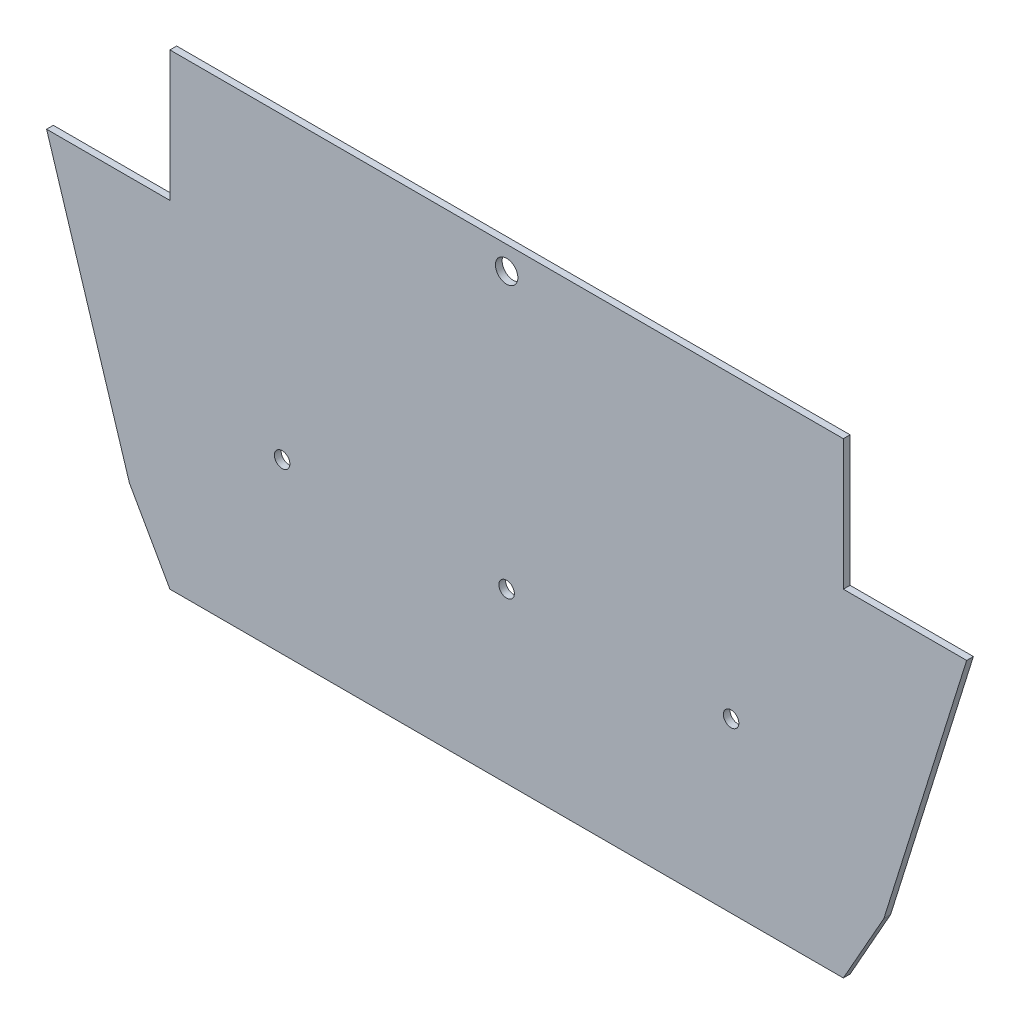
ISO-10303-21;
HEADER;
FILE_DESCRIPTION(('STEP AP214'),'2;1');
FILE_NAME('part.step','',(''),(''),'','','');
FILE_SCHEMA(('AUTOMOTIVE_DESIGN { 1 0 10303 214 1 1 1 1 }'));
ENDSEC;
DATA;
#1=APPLICATION_CONTEXT('core data for automotive mechanical design processes');
#2=APPLICATION_PROTOCOL_DEFINITION('international standard','automotive_design',2000,#1);
#3=PRODUCT_CONTEXT('',#1,'mechanical');
#4=PRODUCT('Part','Part','',(#3));
#5=PRODUCT_RELATED_PRODUCT_CATEGORY('part','',(#4));
#6=PRODUCT_DEFINITION_FORMATION('','',#4);
#7=PRODUCT_DEFINITION_CONTEXT('part definition',#1,'design');
#8=PRODUCT_DEFINITION('design','',#6,#7);
#9=PRODUCT_DEFINITION_SHAPE('','',#8);
#10=(LENGTH_UNIT() NAMED_UNIT(*) SI_UNIT(.MILLI.,.METRE.));
#11=(NAMED_UNIT(*) PLANE_ANGLE_UNIT() SI_UNIT($,.RADIAN.));
#12=(NAMED_UNIT(*) SI_UNIT($,.STERADIAN.) SOLID_ANGLE_UNIT());
#13=UNCERTAINTY_MEASURE_WITH_UNIT(LENGTH_MEASURE(1.E-05),#10,'distance_accuracy_value','');
#14=(GEOMETRIC_REPRESENTATION_CONTEXT(3) GLOBAL_UNCERTAINTY_ASSIGNED_CONTEXT((#13)) GLOBAL_UNIT_ASSIGNED_CONTEXT((#10,
#11,#12)) REPRESENTATION_CONTEXT('',''));
#15=CARTESIAN_POINT('',(0.,0.,0.));
#16=DIRECTION('',(0.,0.,1.));
#17=DIRECTION('',(1.,0.,0.));
#18=AXIS2_PLACEMENT_3D('',#15,#16,#17);
#19=CARTESIAN_POINT('',(0.,0.,-3.));
#20=DIRECTION('',(0.,-1.,0.));
#21=DIRECTION('',(0.,0.,-1.));
#22=AXIS2_PLACEMENT_3D('',#19,#20,#21);
#23=PLANE('',#22);
#24=DIRECTION('',(1.,0.,0.));
#25=VECTOR('',#24,1.);
#26=CARTESIAN_POINT('',(0.,0.,0.));
#27=LINE('',#26,#25);
#28=CARTESIAN_POINT('',(0.,0.,0.));
#29=VERTEX_POINT('',#28);
#30=CARTESIAN_POINT('',(300.,-3.40699690681845E-12,0.));
#31=VERTEX_POINT('',#30);
#32=EDGE_CURVE('E309',#29,#31,#27,.T.);
#33=ORIENTED_EDGE('',*,*,#32,.F.);
#34=DIRECTION('',(0.,0.,1.));
#35=VECTOR('',#34,1.);
#36=CARTESIAN_POINT('',(0.,0.,-3.));
#37=LINE('',#36,#35);
#38=CARTESIAN_POINT('',(0.,0.,-3.));
#39=VERTEX_POINT('',#38);
#40=EDGE_CURVE('E315',#39,#29,#37,.T.);
#41=ORIENTED_EDGE('',*,*,#40,.F.);
#42=DIRECTION('',(1.,0.,0.));
#43=VECTOR('',#42,1.);
#44=CARTESIAN_POINT('',(0.,0.,-3.));
#45=LINE('',#44,#43);
#46=CARTESIAN_POINT('',(300.,-3.40005801291454E-12,-3.));
#47=VERTEX_POINT('',#46);
#48=EDGE_CURVE('E312',#39,#47,#45,.T.);
#49=ORIENTED_EDGE('',*,*,#48,.T.);
#50=DIRECTION('',(0.,0.,1.));
#51=VECTOR('',#50,1.);
#52=CARTESIAN_POINT('',(300.,0.,-3.));
#53=LINE('',#52,#51);
#54=EDGE_CURVE('E318',#47,#31,#53,.T.);
#55=ORIENTED_EDGE('',*,*,#54,.T.);
#56=EDGE_LOOP('',(#33,#41,#49,#55));
#57=FACE_BOUND('',#56,.T.);
#58=ADVANCED_FACE('F142',(#57),#23,.T.);
#59=CARTESIAN_POINT('',(0.,0.,-3.));
#60=DIRECTION('',(0.,0.,-1.));
#61=DIRECTION('',(-1.,0.,0.));
#62=AXIS2_PLACEMENT_3D('',#59,#60,#61);
#63=PLANE('',#62);
#64=CARTESIAN_POINT('',(250.,75.,-3.));
#65=DIRECTION('',(0.,0.,1.));
#66=DIRECTION('',(1.,0.,0.));
#67=AXIS2_PLACEMENT_3D('',#64,#65,#66);
#68=CIRCLE('',#67,3.45);
#69=CARTESIAN_POINT('',(253.45,75.,-3.));
#70=VERTEX_POINT('',#69);
#71=EDGE_CURVE('E294',#70,#70,#68,.T.);
#72=ORIENTED_EDGE('',*,*,#71,.T.);
#73=EDGE_LOOP('',(#72));
#74=FACE_BOUND('',#73,.T.);
#75=CARTESIAN_POINT('',(150.,75.,-3.));
#76=DIRECTION('',(0.,0.,1.));
#77=DIRECTION('',(1.,0.,0.));
#78=AXIS2_PLACEMENT_3D('',#75,#76,#77);
#79=CIRCLE('',#78,3.45);
#80=CARTESIAN_POINT('',(153.45,75.,-3.));
#81=VERTEX_POINT('',#80);
#82=EDGE_CURVE('E300',#81,#81,#79,.T.);
#83=ORIENTED_EDGE('',*,*,#82,.T.);
#84=EDGE_LOOP('',(#83));
#85=FACE_BOUND('',#84,.T.);
#86=CARTESIAN_POINT('',(50.,75.,-3.));
#87=DIRECTION('',(0.,0.,1.));
#88=DIRECTION('',(1.,0.,0.));
#89=AXIS2_PLACEMENT_3D('',#86,#87,#88);
#90=CIRCLE('',#89,3.45);
#91=CARTESIAN_POINT('',(53.45,75.,-3.));
#92=VERTEX_POINT('',#91);
#93=EDGE_CURVE('E306',#92,#92,#90,.T.);
#94=ORIENTED_EDGE('',*,*,#93,.T.);
#95=EDGE_LOOP('',(#94));
#96=FACE_BOUND('',#95,.T.);
#97=ORIENTED_EDGE('',*,*,#48,.F.);
#98=DIRECTION('',(-0.491586972368609,0.870828484029699,0.));
#99=VECTOR('',#98,1.);
#100=CARTESIAN_POINT('',(0.,0.,-3.));
#101=LINE('',#100,#99);
#102=CARTESIAN_POINT('',(-18.0641577581412,32.,-3.));
#103=VERTEX_POINT('',#102);
#104=EDGE_CURVE('E283',#39,#103,#101,.T.);
#105=ORIENTED_EDGE('',*,*,#104,.T.);
#106=DIRECTION('',(0.298274993135947,-0.95447997803503,0.));
#107=VECTOR('',#106,1.);
#108=CARTESIAN_POINT('',(-7.79725384355057,-0.854092526690381,-3.00000000000007));
#109=LINE('',#108,#107);
#110=CARTESIAN_POINT('',(-54.9391577581413,150.,-2.99999999999974));
#111=VERTEX_POINT('',#110);
#112=EDGE_CURVE('E270',#111,#103,#109,.T.);
#113=ORIENTED_EDGE('',*,*,#112,.F.);
#114=DIRECTION('',(-1.,0.,0.));
#115=VECTOR('',#114,1.);
#116=CARTESIAN_POINT('',(-9.03207887907068,150.,-3.));
#117=LINE('',#116,#115);
#118=CARTESIAN_POINT('',(0.,150.,-3.));
#119=VERTEX_POINT('',#118);
#120=EDGE_CURVE('E286',#111,#119,#117,.F.);
#121=ORIENTED_EDGE('',*,*,#120,.T.);
#122=DIRECTION('',(0.,1.,0.));
#123=VECTOR('',#122,1.);
#124=CARTESIAN_POINT('',(0.,159.032078879071,-3.));
#125=LINE('',#124,#123);
#126=CARTESIAN_POINT('',(0.,208.064157758141,-2.99999999999973));
#127=VERTEX_POINT('',#126);
#128=EDGE_CURVE('E226',#119,#127,#125,.T.);
#129=ORIENTED_EDGE('',*,*,#128,.T.);
#130=DIRECTION('',(1.,0.,0.));
#131=VECTOR('',#130,1.);
#132=CARTESIAN_POINT('',(0.,208.064157758141,-2.99999999999973));
#133=LINE('',#132,#131);
#134=CARTESIAN_POINT('',(300.,208.064157758141,-2.99999999999973));
#135=VERTEX_POINT('',#134);
#136=EDGE_CURVE('E229',#135,#127,#133,.F.);
#137=ORIENTED_EDGE('',*,*,#136,.F.);
#138=DIRECTION('',(0.,1.,0.));
#139=VECTOR('',#138,1.);
#140=CARTESIAN_POINT('',(300.,159.032078879071,-3.));
#141=LINE('',#140,#139);
#142=CARTESIAN_POINT('',(300.,150.,-3.));
#143=VERTEX_POINT('',#142);
#144=EDGE_CURVE('E218',#135,#143,#141,.F.);
#145=ORIENTED_EDGE('',*,*,#144,.T.);
#146=DIRECTION('',(-1.,0.,0.));
#147=VECTOR('',#146,1.);
#148=CARTESIAN_POINT('',(309.032078879071,150.,-3.));
#149=LINE('',#148,#147);
#150=CARTESIAN_POINT('',(354.939157758142,150.,-2.99999999999978));
#151=VERTEX_POINT('',#150);
#152=EDGE_CURVE('E265',#143,#151,#149,.F.);
#153=ORIENTED_EDGE('',*,*,#152,.T.);
#154=DIRECTION('',(0.298274993135947,0.95447997803503,0.));
#155=VECTOR('',#154,1.);
#156=CARTESIAN_POINT('',(308.064157758142,0.,-2.99999999999978));
#157=LINE('',#156,#155);
#158=CARTESIAN_POINT('',(318.064157758141,31.9999999999964,-3.));
#159=VERTEX_POINT('',#158);
#160=EDGE_CURVE('E253',#159,#151,#157,.T.);
#161=ORIENTED_EDGE('',*,*,#160,.F.);
#162=DIRECTION('',(-0.491586972368612,-0.870828484029698,0.));
#163=VECTOR('',#162,1.);
#164=CARTESIAN_POINT('',(318.064157758141,31.9999999999964,-3.));
#165=LINE('',#164,#163);
#166=EDGE_CURVE('E267',#159,#47,#165,.T.);
#167=ORIENTED_EDGE('',*,*,#166,.T.);
#168=EDGE_LOOP('',(#97,#105,#113,#121,#129,#137,#145,#153,#161,#167));
#169=FACE_BOUND('',#168,.T.);
#170=CARTESIAN_POINT('',(150.,197.653482949051,-2.99999999999981));
#171=DIRECTION('',(0.,0.,-1.));
#172=DIRECTION('',(0.,1.,0.));
#173=AXIS2_PLACEMENT_3D('',#170,#171,#172);
#174=CIRCLE('',#173,5.00000000000002);
#175=CARTESIAN_POINT('',(150.,202.653482949051,-2.99999999999977));
#176=VERTEX_POINT('',#175);
#177=EDGE_CURVE('E242',#176,#176,#174,.T.);
#178=ORIENTED_EDGE('',*,*,#177,.F.);
#179=EDGE_LOOP('',(#178));
#180=FACE_BOUND('',#179,.T.);
#181=ADVANCED_FACE('F231',(#74,#85,#96,#169,#180),#63,.T.);
#182=CARTESIAN_POINT('',(0.,0.,0.));
#183=DIRECTION('',(0.,0.,-1.));
#184=DIRECTION('',(-1.,0.,0.));
#185=AXIS2_PLACEMENT_3D('',#182,#183,#184);
#186=PLANE('',#185);
#187=CARTESIAN_POINT('',(250.,75.,0.));
#188=DIRECTION('',(0.,0.,1.));
#189=DIRECTION('',(1.,0.,0.));
#190=AXIS2_PLACEMENT_3D('',#187,#188,#189);
#191=CIRCLE('',#190,3.45);
#192=CARTESIAN_POINT('',(253.45,75.,0.));
#193=VERTEX_POINT('',#192);
#194=EDGE_CURVE('E289',#193,#193,#191,.T.);
#195=ORIENTED_EDGE('',*,*,#194,.F.);
#196=EDGE_LOOP('',(#195));
#197=FACE_BOUND('',#196,.T.);
#198=CARTESIAN_POINT('',(150.,75.,0.));
#199=DIRECTION('',(0.,0.,1.));
#200=DIRECTION('',(1.,0.,0.));
#201=AXIS2_PLACEMENT_3D('',#198,#199,#200);
#202=CIRCLE('',#201,3.45);
#203=CARTESIAN_POINT('',(153.45,75.,0.));
#204=VERTEX_POINT('',#203);
#205=EDGE_CURVE('E297',#204,#204,#202,.T.);
#206=ORIENTED_EDGE('',*,*,#205,.F.);
#207=EDGE_LOOP('',(#206));
#208=FACE_BOUND('',#207,.T.);
#209=CARTESIAN_POINT('',(50.,75.,0.));
#210=DIRECTION('',(0.,0.,1.));
#211=DIRECTION('',(1.,0.,0.));
#212=AXIS2_PLACEMENT_3D('',#209,#210,#211);
#213=CIRCLE('',#212,3.45);
#214=CARTESIAN_POINT('',(53.45,75.,0.));
#215=VERTEX_POINT('',#214);
#216=EDGE_CURVE('E303',#215,#215,#213,.T.);
#217=ORIENTED_EDGE('',*,*,#216,.F.);
#218=EDGE_LOOP('',(#217));
#219=FACE_BOUND('',#218,.T.);
#220=DIRECTION('',(0.,1.,0.));
#221=VECTOR('',#220,1.);
#222=CARTESIAN_POINT('',(0.,159.032078879071,0.));
#223=LINE('',#222,#221);
#224=CARTESIAN_POINT('',(0.,150.,0.));
#225=VERTEX_POINT('',#224);
#226=CARTESIAN_POINT('',(0.,208.064157758141,2.77555756156289E-13));
#227=VERTEX_POINT('',#226);
#228=EDGE_CURVE('E250',#225,#227,#223,.T.);
#229=ORIENTED_EDGE('',*,*,#228,.F.);
#230=DIRECTION('',(-1.,0.,0.));
#231=VECTOR('',#230,1.);
#232=CARTESIAN_POINT('',(-9.03207887907068,150.,0.));
#233=LINE('',#232,#231);
#234=CARTESIAN_POINT('',(-54.9391577581413,150.,2.55004350968591E-13));
#235=VERTEX_POINT('',#234);
#236=EDGE_CURVE('E287',#235,#225,#233,.F.);
#237=ORIENTED_EDGE('',*,*,#236,.F.);
#238=DIRECTION('',(0.298274993135947,-0.95447997803503,0.));
#239=VECTOR('',#238,1.);
#240=CARTESIAN_POINT('',(-7.79725384355055,-0.854092526690381,0.));
#241=LINE('',#240,#239);
#242=CARTESIAN_POINT('',(-18.0641577581413,32.,0.));
#243=VERTEX_POINT('',#242);
#244=EDGE_CURVE('E277',#235,#243,#241,.T.);
#245=ORIENTED_EDGE('',*,*,#244,.T.);
#246=DIRECTION('',(-0.491586972368609,0.870828484029699,0.));
#247=VECTOR('',#246,1.);
#248=CARTESIAN_POINT('',(0.,0.,0.));
#249=LINE('',#248,#247);
#250=EDGE_CURVE('E276',#29,#243,#249,.T.);
#251=ORIENTED_EDGE('',*,*,#250,.F.);
#252=ORIENTED_EDGE('',*,*,#32,.T.);
#253=DIRECTION('',(-0.491586972368612,-0.870828484029698,0.));
#254=VECTOR('',#253,1.);
#255=CARTESIAN_POINT('',(318.064157758141,31.9999999999964,0.));
#256=LINE('',#255,#254);
#257=CARTESIAN_POINT('',(318.064157758141,31.9999999999964,2.22044604925031E-13));
#258=VERTEX_POINT('',#257);
#259=EDGE_CURVE('E165',#258,#31,#256,.T.);
#260=ORIENTED_EDGE('',*,*,#259,.F.);
#261=DIRECTION('',(0.298274993135947,0.95447997803503,0.));
#262=VECTOR('',#261,1.);
#263=CARTESIAN_POINT('',(308.064157758142,0.,2.22044604925031E-13));
#264=LINE('',#263,#262);
#265=CARTESIAN_POINT('',(354.939157758142,150.,2.22044604925031E-13));
#266=VERTEX_POINT('',#265);
#267=EDGE_CURVE('E260',#258,#266,#264,.T.);
#268=ORIENTED_EDGE('',*,*,#267,.T.);
#269=DIRECTION('',(-1.,0.,0.));
#270=VECTOR('',#269,1.);
#271=CARTESIAN_POINT('',(309.032078879071,150.,0.));
#272=LINE('',#271,#270);
#273=CARTESIAN_POINT('',(300.,150.,0.));
#274=VERTEX_POINT('',#273);
#275=EDGE_CURVE('E256',#274,#266,#272,.F.);
#276=ORIENTED_EDGE('',*,*,#275,.F.);
#277=DIRECTION('',(0.,1.,0.));
#278=VECTOR('',#277,1.);
#279=CARTESIAN_POINT('',(300.,159.032078879071,0.));
#280=LINE('',#279,#278);
#281=CARTESIAN_POINT('',(300.,208.064157758141,2.77555756156289E-13));
#282=VERTEX_POINT('',#281);
#283=EDGE_CURVE('E157',#282,#274,#280,.F.);
#284=ORIENTED_EDGE('',*,*,#283,.F.);
#285=DIRECTION('',(-1.,0.,0.));
#286=VECTOR('',#285,1.);
#287=CARTESIAN_POINT('',(0.,208.064157758141,2.77555756156289E-13));
#288=LINE('',#287,#286);
#289=EDGE_CURVE('E241',#282,#227,#288,.T.);
#290=ORIENTED_EDGE('',*,*,#289,.T.);
#291=EDGE_LOOP('',(#229,#237,#245,#251,#252,#260,#268,#276,#284,#290));
#292=FACE_BOUND('',#291,.T.);
#293=CARTESIAN_POINT('',(150.,197.653482949051,1.94289029309402E-13));
#294=DIRECTION('',(0.,0.,1.));
#295=DIRECTION('',(0.,-1.,0.));
#296=AXIS2_PLACEMENT_3D('',#293,#294,#295);
#297=CIRCLE('',#296,5.00000000000002);
#298=CARTESIAN_POINT('',(150.,192.653482949051,1.60178277245809E-13));
#299=VERTEX_POINT('',#298);
#300=EDGE_CURVE('E245',#299,#299,#297,.T.);
#301=ORIENTED_EDGE('',*,*,#300,.F.);
#302=EDGE_LOOP('',(#301));
#303=FACE_BOUND('',#302,.T.);
#304=ADVANCED_FACE('F144',(#197,#208,#219,#292,#303),#186,.F.);
#305=CARTESIAN_POINT('',(50.,75.,-3.));
#306=DIRECTION('',(0.,0.,1.));
#307=DIRECTION('',(1.,0.,0.));
#308=AXIS2_PLACEMENT_3D('',#305,#306,#307);
#309=CYLINDRICAL_SURFACE('',#308,3.45);
#310=ORIENTED_EDGE('',*,*,#93,.F.);
#311=EDGE_LOOP('',(#310));
#312=FACE_BOUND('',#311,.T.);
#313=ORIENTED_EDGE('',*,*,#216,.T.);
#314=EDGE_LOOP('',(#313));
#315=FACE_BOUND('',#314,.T.);
#316=ADVANCED_FACE('F365',(#312,#315),#309,.F.);
#317=CARTESIAN_POINT('',(150.,75.,-3.));
#318=DIRECTION('',(0.,0.,1.));
#319=DIRECTION('',(1.,0.,0.));
#320=AXIS2_PLACEMENT_3D('',#317,#318,#319);
#321=CYLINDRICAL_SURFACE('',#320,3.45);
#322=ORIENTED_EDGE('',*,*,#82,.F.);
#323=EDGE_LOOP('',(#322));
#324=FACE_BOUND('',#323,.T.);
#325=ORIENTED_EDGE('',*,*,#205,.T.);
#326=EDGE_LOOP('',(#325));
#327=FACE_BOUND('',#326,.T.);
#328=ADVANCED_FACE('F368',(#324,#327),#321,.F.);
#329=CARTESIAN_POINT('',(250.,75.,-3.));
#330=DIRECTION('',(0.,0.,1.));
#331=DIRECTION('',(1.,0.,0.));
#332=AXIS2_PLACEMENT_3D('',#329,#330,#331);
#333=CYLINDRICAL_SURFACE('',#332,3.45);
#334=ORIENTED_EDGE('',*,*,#71,.F.);
#335=EDGE_LOOP('',(#334));
#336=FACE_BOUND('',#335,.T.);
#337=ORIENTED_EDGE('',*,*,#194,.T.);
#338=EDGE_LOOP('',(#337));
#339=FACE_BOUND('',#338,.T.);
#340=ADVANCED_FACE('F372',(#336,#339),#333,.F.);
#341=CARTESIAN_POINT('',(0.,0.,-1.5));
#342=DIRECTION('',(-0.870828484029699,-0.491586972368609,0.));
#343=DIRECTION('',(-0.491586972368609,0.870828484029699,0.));
#344=AXIS2_PLACEMENT_3D('',#341,#342,#343);
#345=PLANE('',#344);
#346=ORIENTED_EDGE('',*,*,#40,.T.);
#347=ORIENTED_EDGE('',*,*,#250,.T.);
#348=DIRECTION('',(0.,0.,1.));
#349=VECTOR('',#348,1.);
#350=CARTESIAN_POINT('',(-18.0641577581413,32.,-3.));
#351=LINE('',#350,#349);
#352=EDGE_CURVE('E279',#103,#243,#351,.T.);
#353=ORIENTED_EDGE('',*,*,#352,.F.);
#354=ORIENTED_EDGE('',*,*,#104,.F.);
#355=EDGE_LOOP('',(#346,#347,#353,#354));
#356=FACE_BOUND('',#355,.T.);
#357=ADVANCED_FACE('F336',(#356),#345,.T.);
#358=CARTESIAN_POINT('',(-9.03207887907068,150.,-1.5));
#359=DIRECTION('',(0.,-1.,0.));
#360=DIRECTION('',(-1.,0.,0.));
#361=AXIS2_PLACEMENT_3D('',#358,#359,#360);
#362=PLANE('',#361);
#363=ORIENTED_EDGE('',*,*,#236,.T.);
#364=DIRECTION('',(0.,0.,1.));
#365=VECTOR('',#364,1.);
#366=CARTESIAN_POINT('',(0.,150.,-3.));
#367=LINE('',#366,#365);
#368=EDGE_CURVE('E150',#119,#225,#367,.T.);
#369=ORIENTED_EDGE('',*,*,#368,.F.);
#370=ORIENTED_EDGE('',*,*,#120,.F.);
#371=DIRECTION('',(0.,0.,-1.));
#372=VECTOR('',#371,1.);
#373=CARTESIAN_POINT('',(-54.9391577581413,150.,-2.99999999999974));
#374=LINE('',#373,#372);
#375=EDGE_CURVE('E273',#111,#235,#374,.F.);
#376=ORIENTED_EDGE('',*,*,#375,.T.);
#377=EDGE_LOOP('',(#363,#369,#370,#376));
#378=FACE_BOUND('',#377,.T.);
#379=ADVANCED_FACE('F328',(#378),#362,.F.);
#380=CARTESIAN_POINT('',(-7.79725384355057,-0.854092526690381,-3.00000000000007));
#381=DIRECTION('',(0.95447997803503,0.298274993135947,0.));
#382=DIRECTION('',(0.298274993135947,-0.95447997803503,0.));
#383=AXIS2_PLACEMENT_3D('',#380,#381,#382);
#384=PLANE('',#383);
#385=ORIENTED_EDGE('',*,*,#112,.T.);
#386=ORIENTED_EDGE('',*,*,#352,.T.);
#387=ORIENTED_EDGE('',*,*,#244,.F.);
#388=ORIENTED_EDGE('',*,*,#375,.F.);
#389=EDGE_LOOP('',(#385,#386,#387,#388));
#390=FACE_BOUND('',#389,.T.);
#391=ADVANCED_FACE('F332',(#390),#384,.F.);
#392=CARTESIAN_POINT('',(309.032078879071,150.,-1.5));
#393=DIRECTION('',(0.,-1.,0.));
#394=DIRECTION('',(-1.,0.,0.));
#395=AXIS2_PLACEMENT_3D('',#392,#393,#394);
#396=PLANE('',#395);
#397=DIRECTION('',(0.,0.,1.));
#398=VECTOR('',#397,1.);
#399=CARTESIAN_POINT('',(300.,150.,-3.));
#400=LINE('',#399,#398);
#401=EDGE_CURVE('E13',#143,#274,#400,.T.);
#402=ORIENTED_EDGE('',*,*,#401,.T.);
#403=ORIENTED_EDGE('',*,*,#275,.T.);
#404=DIRECTION('',(0.,0.,1.));
#405=VECTOR('',#404,1.);
#406=CARTESIAN_POINT('',(354.939157758142,150.,2.22044604925031E-13));
#407=LINE('',#406,#405);
#408=EDGE_CURVE('E225',#266,#151,#407,.F.);
#409=ORIENTED_EDGE('',*,*,#408,.T.);
#410=ORIENTED_EDGE('',*,*,#152,.F.);
#411=EDGE_LOOP('',(#402,#403,#409,#410));
#412=FACE_BOUND('',#411,.T.);
#413=ADVANCED_FACE('F346',(#412),#396,.F.);
#414=CARTESIAN_POINT('',(318.064157758141,31.9999999999964,-1.5));
#415=DIRECTION('',(0.870828484029698,-0.491586972368612,0.));
#416=DIRECTION('',(-0.491586972368612,-0.870828484029698,0.));
#417=AXIS2_PLACEMENT_3D('',#414,#415,#416);
#418=PLANE('',#417);
#419=ORIENTED_EDGE('',*,*,#259,.T.);
#420=ORIENTED_EDGE('',*,*,#54,.F.);
#421=ORIENTED_EDGE('',*,*,#166,.F.);
#422=DIRECTION('',(0.,0.,-1.));
#423=VECTOR('',#422,1.);
#424=CARTESIAN_POINT('',(318.064157758141,31.9999999999964,2.22044604925031E-13));
#425=LINE('',#424,#423);
#426=EDGE_CURVE('E257',#258,#159,#425,.T.);
#427=ORIENTED_EDGE('',*,*,#426,.F.);
#428=EDGE_LOOP('',(#419,#420,#421,#427));
#429=FACE_BOUND('',#428,.T.);
#430=ADVANCED_FACE('F341',(#429),#418,.T.);
#431=CARTESIAN_POINT('',(308.064157758142,0.,2.22044604925031E-13));
#432=DIRECTION('',(-0.95447997803503,0.298274993135947,0.));
#433=DIRECTION('',(0.298274993135947,0.95447997803503,0.));
#434=AXIS2_PLACEMENT_3D('',#431,#432,#433);
#435=PLANE('',#434);
#436=ORIENTED_EDGE('',*,*,#408,.F.);
#437=ORIENTED_EDGE('',*,*,#267,.F.);
#438=ORIENTED_EDGE('',*,*,#426,.T.);
#439=ORIENTED_EDGE('',*,*,#160,.T.);
#440=EDGE_LOOP('',(#436,#437,#438,#439));
#441=FACE_BOUND('',#440,.T.);
#442=ADVANCED_FACE('F344',(#441),#435,.F.);
#443=CARTESIAN_POINT('',(0.,159.032078879071,-1.5));
#444=DIRECTION('',(-1.,0.,0.));
#445=DIRECTION('',(0.,1.,0.));
#446=AXIS2_PLACEMENT_3D('',#443,#444,#445);
#447=PLANE('',#446);
#448=ORIENTED_EDGE('',*,*,#368,.T.);
#449=ORIENTED_EDGE('',*,*,#228,.T.);
#450=DIRECTION('',(0.,0.,-1.));
#451=VECTOR('',#450,1.);
#452=CARTESIAN_POINT('',(0.,208.064157758141,2.77555756156289E-13));
#453=LINE('',#452,#451);
#454=EDGE_CURVE('E593',#227,#127,#453,.T.);
#455=ORIENTED_EDGE('',*,*,#454,.T.);
#456=ORIENTED_EDGE('',*,*,#128,.F.);
#457=EDGE_LOOP('',(#448,#449,#455,#456));
#458=FACE_BOUND('',#457,.T.);
#459=ADVANCED_FACE('F323',(#458),#447,.T.);
#460=CARTESIAN_POINT('',(300.,159.032078879071,-1.5));
#461=DIRECTION('',(-1.,0.,0.));
#462=DIRECTION('',(0.,1.,0.));
#463=AXIS2_PLACEMENT_3D('',#460,#461,#462);
#464=PLANE('',#463);
#465=ORIENTED_EDGE('',*,*,#283,.T.);
#466=ORIENTED_EDGE('',*,*,#401,.F.);
#467=ORIENTED_EDGE('',*,*,#144,.F.);
#468=DIRECTION('',(0.,0.,-1.));
#469=VECTOR('',#468,1.);
#470=CARTESIAN_POINT('',(300.,208.064157758141,2.77555756156289E-13));
#471=LINE('',#470,#469);
#472=EDGE_CURVE('E222',#282,#135,#471,.T.);
#473=ORIENTED_EDGE('',*,*,#472,.F.);
#474=EDGE_LOOP('',(#465,#466,#467,#473));
#475=FACE_BOUND('',#474,.T.);
#476=ADVANCED_FACE('F220',(#475),#464,.F.);
#477=CARTESIAN_POINT('',(0.,208.064157758141,2.77555756156289E-13));
#478=DIRECTION('',(0.,-1.,0.));
#479=DIRECTION('',(0.,0.,-1.));
#480=AXIS2_PLACEMENT_3D('',#477,#478,#479);
#481=PLANE('',#480);
#482=ORIENTED_EDGE('',*,*,#136,.T.);
#483=ORIENTED_EDGE('',*,*,#454,.F.);
#484=ORIENTED_EDGE('',*,*,#289,.F.);
#485=ORIENTED_EDGE('',*,*,#472,.T.);
#486=EDGE_LOOP('',(#482,#483,#484,#485));
#487=FACE_BOUND('',#486,.T.);
#488=ADVANCED_FACE('F239',(#487),#481,.F.);
#489=CARTESIAN_POINT('',(150.,197.653482949051,-9.99999999999982));
#490=DIRECTION('',(0.,0.,1.));
#491=DIRECTION('',(0.,-1.,0.));
#492=AXIS2_PLACEMENT_3D('',#489,#490,#491);
#493=CYLINDRICAL_SURFACE('',#492,5.00000000000002);
#494=ORIENTED_EDGE('',*,*,#177,.T.);
#495=EDGE_LOOP('',(#494));
#496=FACE_BOUND('',#495,.T.);
#497=ORIENTED_EDGE('',*,*,#300,.T.);
#498=EDGE_LOOP('',(#497));
#499=FACE_BOUND('',#498,.T.);
#500=ADVANCED_FACE('F435',(#496,#499),#493,.F.);
#501=CLOSED_SHELL('',(#58,#181,#304,#316,#328,#340,#357,#379,#391,#413,#430,#442,#459,#476,#488,#500));
#502=MANIFOLD_SOLID_BREP('B2',#501);
#503=ADVANCED_BREP_SHAPE_REPRESENTATION('',(#18,#502),#14);
#504=SHAPE_DEFINITION_REPRESENTATION(#9,#503);
ENDSEC;
END-ISO-10303-21;
